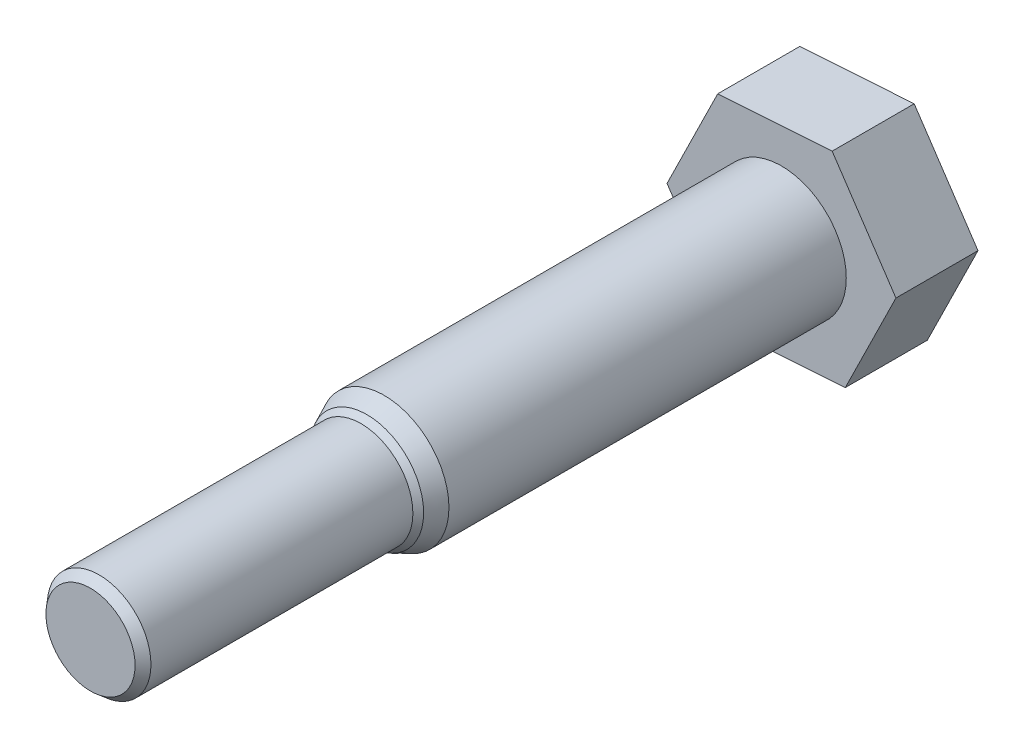
ISO-10303-21;
HEADER;
FILE_DESCRIPTION(('STEP AP214'),'2;1');
FILE_NAME('part.step','',(''),(''),'','','');
FILE_SCHEMA(('AUTOMOTIVE_DESIGN { 1 0 10303 214 1 1 1 1 }'));
ENDSEC;
DATA;
#1=APPLICATION_CONTEXT('core data for automotive mechanical design processes');
#2=APPLICATION_PROTOCOL_DEFINITION('international standard','automotive_design',2000,#1);
#3=PRODUCT_CONTEXT('',#1,'mechanical');
#4=PRODUCT('Part','Part','',(#3));
#5=PRODUCT_RELATED_PRODUCT_CATEGORY('part','',(#4));
#6=PRODUCT_DEFINITION_FORMATION('','',#4);
#7=PRODUCT_DEFINITION_CONTEXT('part definition',#1,'design');
#8=PRODUCT_DEFINITION('design','',#6,#7);
#9=PRODUCT_DEFINITION_SHAPE('','',#8);
#10=(LENGTH_UNIT() NAMED_UNIT(*) SI_UNIT(.MILLI.,.METRE.));
#11=(NAMED_UNIT(*) PLANE_ANGLE_UNIT() SI_UNIT($,.RADIAN.));
#12=(NAMED_UNIT(*) SI_UNIT($,.STERADIAN.) SOLID_ANGLE_UNIT());
#13=UNCERTAINTY_MEASURE_WITH_UNIT(LENGTH_MEASURE(1.E-05),#10,'distance_accuracy_value','');
#14=(GEOMETRIC_REPRESENTATION_CONTEXT(3) GLOBAL_UNCERTAINTY_ASSIGNED_CONTEXT((#13)) GLOBAL_UNIT_ASSIGNED_CONTEXT((#10,
#11,#12)) REPRESENTATION_CONTEXT('',''));
#15=CARTESIAN_POINT('',(0.,0.,0.));
#16=DIRECTION('',(0.,0.,1.));
#17=DIRECTION('',(1.,0.,0.));
#18=AXIS2_PLACEMENT_3D('',#15,#16,#17);
#19=CARTESIAN_POINT('',(0.,0.,111.));
#20=DIRECTION('',(0.,0.,-1.));
#21=DIRECTION('',(-1.,0.,0.));
#22=AXIS2_PLACEMENT_3D('',#19,#20,#21);
#23=CYLINDRICAL_SURFACE('',#22,15.);
#24=CARTESIAN_POINT('',(0.,0.,19.));
#25=DIRECTION('',(0.,0.,1.));
#26=DIRECTION('',(1.,0.,0.));
#27=AXIS2_PLACEMENT_3D('',#24,#25,#26);
#28=CIRCLE('',#27,15.);
#29=CARTESIAN_POINT('',(15.,0.,19.));
#30=VERTEX_POINT('',#29);
#31=EDGE_CURVE('E138',#30,#30,#28,.T.);
#32=ORIENTED_EDGE('',*,*,#31,.T.);
#33=EDGE_LOOP('',(#32));
#34=FACE_BOUND('',#33,.T.);
#35=CARTESIAN_POINT('',(0.,0.,111.));
#36=DIRECTION('',(0.,0.,1.));
#37=DIRECTION('',(1.,0.,0.));
#38=AXIS2_PLACEMENT_3D('',#35,#36,#37);
#39=CIRCLE('',#38,15.);
#40=CARTESIAN_POINT('',(15.,0.,111.));
#41=VERTEX_POINT('',#40);
#42=EDGE_CURVE('E40',#41,#41,#39,.T.);
#43=ORIENTED_EDGE('',*,*,#42,.F.);
#44=EDGE_LOOP('',(#43));
#45=FACE_BOUND('',#44,.T.);
#46=ADVANCED_FACE('F32',(#34,#45),#23,.T.);
#47=CARTESIAN_POINT('',(14.7706906325741,-22.0717020542168,19.));
#48=DIRECTION('',(0.,0.,1.));
#49=DIRECTION('',(1.,0.,0.));
#50=AXIS2_PLACEMENT_3D('',#47,#48,#49);
#51=PLANE('',#50);
#52=DIRECTION('',(0.997811878273376,0.06611698402496,0.));
#53=VECTOR('',#52,1.);
#54=CARTESIAN_POINT('',(-11.7293093674259,-23.8276443463584,19.));
#55=LINE('',#54,#53);
#56=CARTESIAN_POINT('',(-11.7293093674259,-23.8276443463584,19.));
#57=VERTEX_POINT('',#56);
#58=CARTESIAN_POINT('',(14.7706906325741,-22.0717020542168,19.));
#59=VERTEX_POINT('',#58);
#60=EDGE_CURVE('E129',#57,#59,#55,.T.);
#61=ORIENTED_EDGE('',*,*,#60,.T.);
#62=DIRECTION('',(0.441646951349463,0.89718892679509,0.));
#63=VECTOR('',#62,1.);
#64=CARTESIAN_POINT('',(14.7706906325741,-22.0717020542168,19.));
#65=LINE('',#64,#63);
#66=CARTESIAN_POINT('',(26.5,1.75594229214158,19.));
#67=VERTEX_POINT('',#66);
#68=EDGE_CURVE('E86',#59,#67,#65,.T.);
#69=ORIENTED_EDGE('',*,*,#68,.T.);
#70=DIRECTION('',(-0.556164926923913,0.83107194277013,0.));
#71=VECTOR('',#70,1.);
#72=CARTESIAN_POINT('',(26.5,1.75594229214158,19.));
#73=LINE('',#72,#71);
#74=CARTESIAN_POINT('',(11.7293093674259,23.8276443463584,19.));
#75=VERTEX_POINT('',#74);
#76=EDGE_CURVE('E100',#67,#75,#73,.T.);
#77=ORIENTED_EDGE('',*,*,#76,.T.);
#78=DIRECTION('',(-0.997811878273376,-0.06611698402496,0.));
#79=VECTOR('',#78,1.);
#80=CARTESIAN_POINT('',(11.7293093674259,23.8276443463584,19.));
#81=LINE('',#80,#79);
#82=CARTESIAN_POINT('',(-14.7706906325741,22.0717020542168,19.));
#83=VERTEX_POINT('',#82);
#84=EDGE_CURVE('E93',#75,#83,#81,.T.);
#85=ORIENTED_EDGE('',*,*,#84,.T.);
#86=DIRECTION('',(-0.441646951349463,-0.89718892679509,0.));
#87=VECTOR('',#86,1.);
#88=CARTESIAN_POINT('',(-14.7706906325741,22.0717020542168,19.));
#89=LINE('',#88,#87);
#90=CARTESIAN_POINT('',(-26.5,-1.75594229214157,19.));
#91=VERTEX_POINT('',#90);
#92=EDGE_CURVE('E98',#83,#91,#89,.T.);
#93=ORIENTED_EDGE('',*,*,#92,.T.);
#94=DIRECTION('',(0.556164926923913,-0.83107194277013,0.));
#95=VECTOR('',#94,1.);
#96=CARTESIAN_POINT('',(-26.5,-1.75594229214157,19.));
#97=LINE('',#96,#95);
#98=EDGE_CURVE('E48',#91,#57,#97,.T.);
#99=ORIENTED_EDGE('',*,*,#98,.T.);
#100=EDGE_LOOP('',(#61,#69,#77,#85,#93,#99));
#101=FACE_BOUND('',#100,.T.);
#102=ORIENTED_EDGE('',*,*,#31,.F.);
#103=EDGE_LOOP('',(#102));
#104=FACE_BOUND('',#103,.T.);
#105=ADVANCED_FACE('F95',(#101,#104),#51,.T.);
#106=CARTESIAN_POINT('',(-11.7293093674259,-23.8276443463584,19.));
#107=DIRECTION('',(-0.0661169840249599,0.997811878273376,0.));
#108=DIRECTION('',(-0.997811878273376,-0.06611698402496,0.));
#109=AXIS2_PLACEMENT_3D('',#106,#107,#108);
#110=PLANE('',#109);
#111=DIRECTION('',(0.997811878273376,0.06611698402496,0.));
#112=VECTOR('',#111,1.);
#113=CARTESIAN_POINT('',(-11.7293093674259,-23.8276443463584,0.));
#114=LINE('',#113,#112);
#115=CARTESIAN_POINT('',(-11.7293093674259,-23.8276443463584,0.));
#116=VERTEX_POINT('',#115);
#117=CARTESIAN_POINT('',(14.7706906325741,-22.0717020542168,0.));
#118=VERTEX_POINT('',#117);
#119=EDGE_CURVE('E118',#116,#118,#114,.T.);
#120=ORIENTED_EDGE('',*,*,#119,.T.);
#121=DIRECTION('',(0.,0.,-1.));
#122=VECTOR('',#121,1.);
#123=CARTESIAN_POINT('',(14.7706906325741,-22.0717020542168,19.));
#124=LINE('',#123,#122);
#125=EDGE_CURVE('E136',#59,#118,#124,.T.);
#126=ORIENTED_EDGE('',*,*,#125,.F.);
#127=ORIENTED_EDGE('',*,*,#60,.F.);
#128=DIRECTION('',(0.,0.,-1.));
#129=VECTOR('',#128,1.);
#130=CARTESIAN_POINT('',(-11.7293093674259,-23.8276443463584,19.));
#131=LINE('',#130,#129);
#132=EDGE_CURVE('E114',#57,#116,#131,.T.);
#133=ORIENTED_EDGE('',*,*,#132,.T.);
#134=EDGE_LOOP('',(#120,#126,#127,#133));
#135=FACE_BOUND('',#134,.T.);
#136=ADVANCED_FACE('F145',(#135),#110,.F.);
#137=CARTESIAN_POINT('',(14.7706906325741,-22.0717020542168,19.));
#138=DIRECTION('',(-0.89718892679509,0.441646951349463,0.));
#139=DIRECTION('',(-0.441646951349463,-0.89718892679509,0.));
#140=AXIS2_PLACEMENT_3D('',#137,#138,#139);
#141=PLANE('',#140);
#142=DIRECTION('',(0.441646951349463,0.89718892679509,0.));
#143=VECTOR('',#142,1.);
#144=CARTESIAN_POINT('',(14.7706906325741,-22.0717020542168,0.));
#145=LINE('',#144,#143);
#146=CARTESIAN_POINT('',(26.5,1.75594229214158,0.));
#147=VERTEX_POINT('',#146);
#148=EDGE_CURVE('E121',#118,#147,#145,.T.);
#149=ORIENTED_EDGE('',*,*,#148,.T.);
#150=DIRECTION('',(0.,0.,-1.));
#151=VECTOR('',#150,1.);
#152=CARTESIAN_POINT('',(26.5,1.75594229214158,19.));
#153=LINE('',#152,#151);
#154=EDGE_CURVE('E133',#67,#147,#153,.T.);
#155=ORIENTED_EDGE('',*,*,#154,.F.);
#156=ORIENTED_EDGE('',*,*,#68,.F.);
#157=ORIENTED_EDGE('',*,*,#125,.T.);
#158=EDGE_LOOP('',(#149,#155,#156,#157));
#159=FACE_BOUND('',#158,.T.);
#160=ADVANCED_FACE('F151',(#159),#141,.F.);
#161=CARTESIAN_POINT('',(26.5,1.75594229214158,19.));
#162=DIRECTION('',(-0.83107194277013,-0.556164926923913,0.));
#163=DIRECTION('',(0.556164926923913,-0.83107194277013,0.));
#164=AXIS2_PLACEMENT_3D('',#161,#162,#163);
#165=PLANE('',#164);
#166=DIRECTION('',(-0.556164926923913,0.83107194277013,0.));
#167=VECTOR('',#166,1.);
#168=CARTESIAN_POINT('',(26.5,1.75594229214158,0.));
#169=LINE('',#168,#167);
#170=CARTESIAN_POINT('',(11.7293093674259,23.8276443463584,0.));
#171=VERTEX_POINT('',#170);
#172=EDGE_CURVE('E124',#147,#171,#169,.T.);
#173=ORIENTED_EDGE('',*,*,#172,.T.);
#174=DIRECTION('',(0.,0.,-1.));
#175=VECTOR('',#174,1.);
#176=CARTESIAN_POINT('',(11.7293093674259,23.8276443463584,19.));
#177=LINE('',#176,#175);
#178=EDGE_CURVE('E109',#75,#171,#177,.T.);
#179=ORIENTED_EDGE('',*,*,#178,.F.);
#180=ORIENTED_EDGE('',*,*,#76,.F.);
#181=ORIENTED_EDGE('',*,*,#154,.T.);
#182=EDGE_LOOP('',(#173,#179,#180,#181));
#183=FACE_BOUND('',#182,.T.);
#184=ADVANCED_FACE('F166',(#183),#165,.F.);
#185=CARTESIAN_POINT('',(11.7293093674259,23.8276443463584,19.));
#186=DIRECTION('',(0.0661169840249599,-0.997811878273376,0.));
#187=DIRECTION('',(0.997811878273376,0.06611698402496,0.));
#188=AXIS2_PLACEMENT_3D('',#185,#186,#187);
#189=PLANE('',#188);
#190=DIRECTION('',(-0.997811878273376,-0.06611698402496,0.));
#191=VECTOR('',#190,1.);
#192=CARTESIAN_POINT('',(11.7293093674259,23.8276443463584,0.));
#193=LINE('',#192,#191);
#194=CARTESIAN_POINT('',(-14.7706906325741,22.0717020542168,0.));
#195=VERTEX_POINT('',#194);
#196=EDGE_CURVE('E108',#171,#195,#193,.T.);
#197=ORIENTED_EDGE('',*,*,#196,.T.);
#198=DIRECTION('',(0.,0.,-1.));
#199=VECTOR('',#198,1.);
#200=CARTESIAN_POINT('',(-14.7706906325741,22.0717020542168,19.));
#201=LINE('',#200,#199);
#202=EDGE_CURVE('E105',#83,#195,#201,.T.);
#203=ORIENTED_EDGE('',*,*,#202,.F.);
#204=ORIENTED_EDGE('',*,*,#84,.F.);
#205=ORIENTED_EDGE('',*,*,#178,.T.);
#206=EDGE_LOOP('',(#197,#203,#204,#205));
#207=FACE_BOUND('',#206,.T.);
#208=ADVANCED_FACE('F106',(#207),#189,.F.);
#209=CARTESIAN_POINT('',(-14.7706906325741,22.0717020542168,19.));
#210=DIRECTION('',(0.89718892679509,-0.441646951349463,0.));
#211=DIRECTION('',(0.441646951349463,0.89718892679509,0.));
#212=AXIS2_PLACEMENT_3D('',#209,#210,#211);
#213=PLANE('',#212);
#214=DIRECTION('',(-0.441646951349463,-0.89718892679509,0.));
#215=VECTOR('',#214,1.);
#216=CARTESIAN_POINT('',(-14.7706906325741,22.0717020542168,0.));
#217=LINE('',#216,#215);
#218=CARTESIAN_POINT('',(-26.5,-1.75594229214157,0.));
#219=VERTEX_POINT('',#218);
#220=EDGE_CURVE('E71',#195,#219,#217,.T.);
#221=ORIENTED_EDGE('',*,*,#220,.T.);
#222=DIRECTION('',(0.,0.,-1.));
#223=VECTOR('',#222,1.);
#224=CARTESIAN_POINT('',(-26.5,-1.75594229214157,19.));
#225=LINE('',#224,#223);
#226=EDGE_CURVE('E110',#91,#219,#225,.T.);
#227=ORIENTED_EDGE('',*,*,#226,.F.);
#228=ORIENTED_EDGE('',*,*,#92,.F.);
#229=ORIENTED_EDGE('',*,*,#202,.T.);
#230=EDGE_LOOP('',(#221,#227,#228,#229));
#231=FACE_BOUND('',#230,.T.);
#232=ADVANCED_FACE('F112',(#231),#213,.F.);
#233=CARTESIAN_POINT('',(-26.5,-1.75594229214157,19.));
#234=DIRECTION('',(0.83107194277013,0.556164926923913,0.));
#235=DIRECTION('',(-0.556164926923913,0.83107194277013,0.));
#236=AXIS2_PLACEMENT_3D('',#233,#234,#235);
#237=PLANE('',#236);
#238=DIRECTION('',(0.556164926923913,-0.83107194277013,0.));
#239=VECTOR('',#238,1.);
#240=CARTESIAN_POINT('',(-26.5,-1.75594229214157,0.));
#241=LINE('',#240,#239);
#242=EDGE_CURVE('E77',#219,#116,#241,.T.);
#243=ORIENTED_EDGE('',*,*,#242,.T.);
#244=ORIENTED_EDGE('',*,*,#132,.F.);
#245=ORIENTED_EDGE('',*,*,#98,.F.);
#246=ORIENTED_EDGE('',*,*,#226,.T.);
#247=EDGE_LOOP('',(#243,#244,#245,#246));
#248=FACE_BOUND('',#247,.T.);
#249=ADVANCED_FACE('F158',(#248),#237,.F.);
#250=CARTESIAN_POINT('',(0.,0.,0.));
#251=DIRECTION('',(0.,0.,1.));
#252=DIRECTION('',(1.,0.,0.));
#253=AXIS2_PLACEMENT_3D('',#250,#251,#252);
#254=PLANE('',#253);
#255=ORIENTED_EDGE('',*,*,#119,.F.);
#256=ORIENTED_EDGE('',*,*,#242,.F.);
#257=ORIENTED_EDGE('',*,*,#220,.F.);
#258=ORIENTED_EDGE('',*,*,#196,.F.);
#259=ORIENTED_EDGE('',*,*,#172,.F.);
#260=ORIENTED_EDGE('',*,*,#148,.F.);
#261=EDGE_LOOP('',(#255,#256,#257,#258,#259,#260));
#262=FACE_BOUND('',#261,.T.);
#263=ADVANCED_FACE('F161',(#262),#254,.F.);
#264=CARTESIAN_POINT('',(0.,0.,111.));
#265=DIRECTION('',(0.,0.,-1.));
#266=DIRECTION('',(1.,0.,0.));
#267=AXIS2_PLACEMENT_3D('',#264,#265,#266);
#268=CONICAL_SURFACE('',#267,15.,0.436332312998583);
#269=CARTESIAN_POINT('',(0.,0.,115.));
#270=DIRECTION('',(0.,0.,1.));
#271=DIRECTION('',(1.,0.,0.));
#272=AXIS2_PLACEMENT_3D('',#269,#270,#271);
#273=CIRCLE('',#272,13.13476936738);
#274=CARTESIAN_POINT('',(13.13476936738,0.,115.));
#275=VERTEX_POINT('',#274);
#276=EDGE_CURVE('E122',#275,#275,#273,.T.);
#277=ORIENTED_EDGE('',*,*,#276,.F.);
#278=EDGE_LOOP('',(#277));
#279=FACE_BOUND('',#278,.T.);
#280=ORIENTED_EDGE('',*,*,#42,.T.);
#281=EDGE_LOOP('',(#280));
#282=FACE_BOUND('',#281,.T.);
#283=ADVANCED_FACE('F156',(#279,#282),#268,.T.);
#284=CARTESIAN_POINT('',(0.,0.,115.));
#285=DIRECTION('',(0.,0.,-1.));
#286=DIRECTION('',(1.,0.,0.));
#287=AXIS2_PLACEMENT_3D('',#284,#285,#286);
#288=CONICAL_SURFACE('',#287,13.13476936738,0.698131700797733);
#289=ORIENTED_EDGE('',*,*,#276,.T.);
#290=EDGE_LOOP('',(#289));
#291=FACE_BOUND('',#290,.T.);
#292=CARTESIAN_POINT('',(0.,0.,116.352365470341));
#293=DIRECTION('',(0.,0.,-1.));
#294=DIRECTION('',(-1.,0.,0.));
#295=AXIS2_PLACEMENT_3D('',#292,#293,#294);
#296=CIRCLE('',#295,12.);
#297=CARTESIAN_POINT('',(-12.,0.,116.352365470341));
#298=VERTEX_POINT('',#297);
#299=EDGE_CURVE('E11',#298,#298,#296,.T.);
#300=ORIENTED_EDGE('',*,*,#299,.T.);
#301=EDGE_LOOP('',(#300));
#302=FACE_BOUND('',#301,.T.);
#303=ADVANCED_FACE('F176',(#291,#302),#288,.T.);
#304=CARTESIAN_POINT('',(0.,0.,177.));
#305=DIRECTION('',(0.,0.,-1.));
#306=DIRECTION('',(-1.,0.,0.));
#307=AXIS2_PLACEMENT_3D('',#304,#305,#306);
#308=CYLINDRICAL_SURFACE('',#307,12.);
#309=CARTESIAN_POINT('',(0.,0.,177.));
#310=DIRECTION('',(0.,0.,1.));
#311=DIRECTION('',(1.,0.,0.));
#312=AXIS2_PLACEMENT_3D('',#309,#310,#311);
#313=CIRCLE('',#312,12.);
#314=CARTESIAN_POINT('',(12.,0.,177.));
#315=VERTEX_POINT('',#314);
#316=EDGE_CURVE('E187',#315,#315,#313,.T.);
#317=ORIENTED_EDGE('',*,*,#316,.F.);
#318=EDGE_LOOP('',(#317));
#319=FACE_BOUND('',#318,.T.);
#320=ORIENTED_EDGE('',*,*,#299,.F.);
#321=EDGE_LOOP('',(#320));
#322=FACE_BOUND('',#321,.T.);
#323=ADVANCED_FACE('F199',(#319,#322),#308,.T.);
#324=CARTESIAN_POINT('',(0.,0.,177.));
#325=DIRECTION('',(0.,0.,-1.));
#326=DIRECTION('',(1.,0.,0.));
#327=AXIS2_PLACEMENT_3D('',#324,#325,#326);
#328=CONICAL_SURFACE('',#327,12.,0.698131700797733);
#329=CARTESIAN_POINT('',(0.,0.,179.));
#330=DIRECTION('',(0.,0.,1.));
#331=DIRECTION('',(1.,0.,0.));
#332=AXIS2_PLACEMENT_3D('',#329,#330,#331);
#333=CIRCLE('',#332,10.3218007376454);
#334=CARTESIAN_POINT('',(10.3218007376454,0.,179.));
#335=VERTEX_POINT('',#334);
#336=EDGE_CURVE('E190',#335,#335,#333,.T.);
#337=ORIENTED_EDGE('',*,*,#336,.F.);
#338=EDGE_LOOP('',(#337));
#339=FACE_BOUND('',#338,.T.);
#340=ORIENTED_EDGE('',*,*,#316,.T.);
#341=EDGE_LOOP('',(#340));
#342=FACE_BOUND('',#341,.T.);
#343=ADVANCED_FACE('F196',(#339,#342),#328,.T.);
#344=CARTESIAN_POINT('',(0.,0.,179.));
#345=DIRECTION('',(0.,0.,1.));
#346=DIRECTION('',(1.,0.,0.));
#347=AXIS2_PLACEMENT_3D('',#344,#345,#346);
#348=PLANE('',#347);
#349=ORIENTED_EDGE('',*,*,#336,.T.);
#350=EDGE_LOOP('',(#349));
#351=FACE_BOUND('',#350,.T.);
#352=ADVANCED_FACE('F194',(#351),#348,.T.);
#353=CLOSED_SHELL('',(#46,#105,#136,#160,#184,#208,#232,#249,#263,#283,#303,#323,#343,#352));
#354=MANIFOLD_SOLID_BREP('B2',#353);
#355=ADVANCED_BREP_SHAPE_REPRESENTATION('',(#18,#354),#14);
#356=SHAPE_DEFINITION_REPRESENTATION(#9,#355);
ENDSEC;
END-ISO-10303-21;
